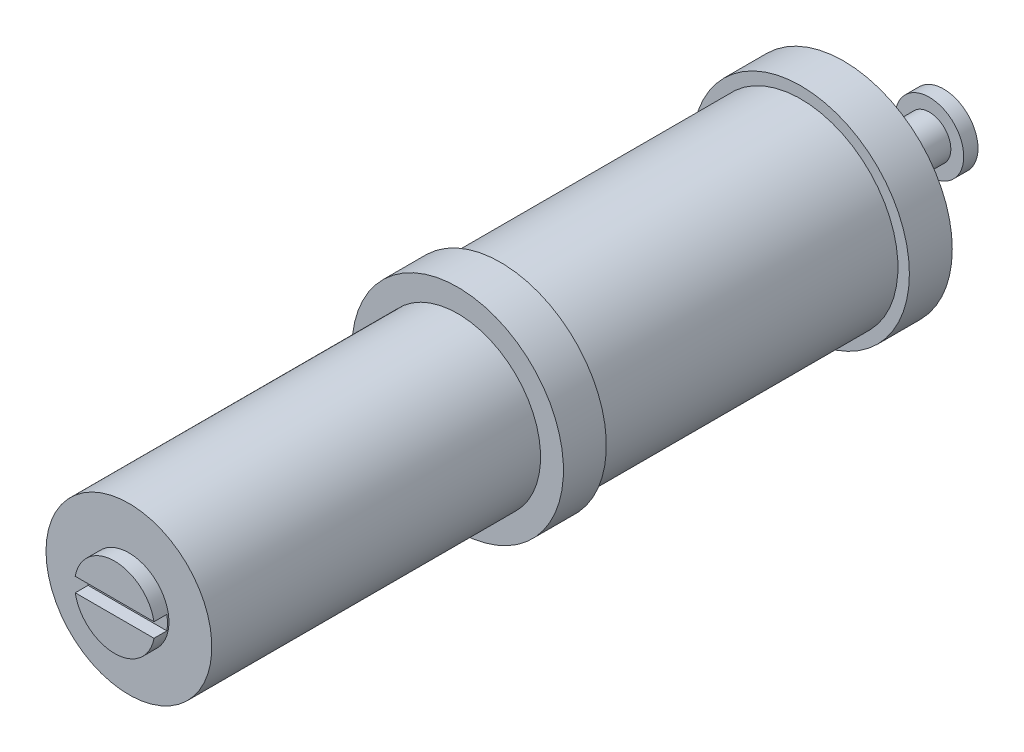
ISO-10303-21;
HEADER;
FILE_DESCRIPTION(('STEP AP214'),'2;1');
FILE_NAME('part.step','',(''),(''),'','','');
FILE_SCHEMA(('AUTOMOTIVE_DESIGN { 1 0 10303 214 1 1 1 1 }'));
ENDSEC;
DATA;
#1=APPLICATION_CONTEXT('core data for automotive mechanical design processes');
#2=APPLICATION_PROTOCOL_DEFINITION('international standard','automotive_design',2000,#1);
#3=PRODUCT_CONTEXT('',#1,'mechanical');
#4=PRODUCT('Part','Part','',(#3));
#5=PRODUCT_RELATED_PRODUCT_CATEGORY('part','',(#4));
#6=PRODUCT_DEFINITION_FORMATION('','',#4);
#7=PRODUCT_DEFINITION_CONTEXT('part definition',#1,'design');
#8=PRODUCT_DEFINITION('design','',#6,#7);
#9=PRODUCT_DEFINITION_SHAPE('','',#8);
#10=(LENGTH_UNIT() NAMED_UNIT(*) SI_UNIT(.MILLI.,.METRE.));
#11=(NAMED_UNIT(*) PLANE_ANGLE_UNIT() SI_UNIT($,.RADIAN.));
#12=(NAMED_UNIT(*) SI_UNIT($,.STERADIAN.) SOLID_ANGLE_UNIT());
#13=UNCERTAINTY_MEASURE_WITH_UNIT(LENGTH_MEASURE(1.E-05),#10,'distance_accuracy_value','');
#14=(GEOMETRIC_REPRESENTATION_CONTEXT(3) GLOBAL_UNCERTAINTY_ASSIGNED_CONTEXT((#13)) GLOBAL_UNIT_ASSIGNED_CONTEXT((#10,
#11,#12)) REPRESENTATION_CONTEXT('',''));
#15=CARTESIAN_POINT('',(0.,0.,0.));
#16=DIRECTION('',(0.,0.,1.));
#17=DIRECTION('',(1.,0.,0.));
#18=AXIS2_PLACEMENT_3D('',#15,#16,#17);
#19=CARTESIAN_POINT('',(0.,0.,0.));
#20=DIRECTION('',(0.,0.,1.));
#21=DIRECTION('',(1.,0.,0.));
#22=AXIS2_PLACEMENT_3D('',#19,#20,#21);
#23=CYLINDRICAL_SURFACE('',#22,3.8);
#24=CARTESIAN_POINT('',(0.,0.,1.5));
#25=DIRECTION('',(0.,0.,-1.));
#26=DIRECTION('',(1.,0.,0.));
#27=AXIS2_PLACEMENT_3D('',#24,#25,#26);
#28=CIRCLE('',#27,3.8);
#29=CARTESIAN_POINT('',(3.8,0.,1.5));
#30=VERTEX_POINT('',#29);
#31=EDGE_CURVE('E10',#30,#30,#28,.T.);
#32=ORIENTED_EDGE('',*,*,#31,.T.);
#33=EDGE_LOOP('',(#32));
#34=FACE_BOUND('',#33,.T.);
#35=CARTESIAN_POINT('',(0.,0.,0.));
#36=DIRECTION('',(0.,0.,1.));
#37=DIRECTION('',(1.,0.,0.));
#38=AXIS2_PLACEMENT_3D('',#35,#36,#37);
#39=CIRCLE('',#38,3.8);
#40=CARTESIAN_POINT('',(3.8,0.,0.));
#41=VERTEX_POINT('',#40);
#42=EDGE_CURVE('E26',#41,#41,#39,.T.);
#43=ORIENTED_EDGE('',*,*,#42,.T.);
#44=EDGE_LOOP('',(#43));
#45=FACE_BOUND('',#44,.T.);
#46=ADVANCED_FACE('F16',(#34,#45),#23,.T.);
#47=CARTESIAN_POINT('',(0.,0.,1.5));
#48=DIRECTION('',(0.,0.,1.));
#49=DIRECTION('',(1.,0.,0.));
#50=AXIS2_PLACEMENT_3D('',#47,#48,#49);
#51=PLANE('',#50);
#52=ORIENTED_EDGE('',*,*,#31,.F.);
#53=EDGE_LOOP('',(#52));
#54=FACE_BOUND('',#53,.T.);
#55=CARTESIAN_POINT('',(0.,0.,1.5));
#56=DIRECTION('',(0.,0.,1.));
#57=DIRECTION('',(-1.,0.,0.));
#58=AXIS2_PLACEMENT_3D('',#55,#56,#57);
#59=CIRCLE('',#58,3.4);
#60=CARTESIAN_POINT('',(-3.4,0.,1.5));
#61=VERTEX_POINT('',#60);
#62=EDGE_CURVE('E97',#61,#61,#59,.T.);
#63=ORIENTED_EDGE('',*,*,#62,.F.);
#64=EDGE_LOOP('',(#63));
#65=FACE_BOUND('',#64,.T.);
#66=ADVANCED_FACE('F150',(#54,#65),#51,.T.);
#67=CARTESIAN_POINT('',(0.,0.,13.5));
#68=DIRECTION('',(0.,0.,-1.));
#69=DIRECTION('',(-1.,0.,0.));
#70=AXIS2_PLACEMENT_3D('',#67,#68,#69);
#71=CYLINDRICAL_SURFACE('',#70,3.7);
#72=CARTESIAN_POINT('',(0.,0.,12.));
#73=DIRECTION('',(0.,0.,1.));
#74=DIRECTION('',(-1.,0.,0.));
#75=AXIS2_PLACEMENT_3D('',#72,#73,#74);
#76=CIRCLE('',#75,3.7);
#77=CARTESIAN_POINT('',(-3.7,0.,12.));
#78=VERTEX_POINT('',#77);
#79=EDGE_CURVE('E121',#78,#78,#76,.T.);
#80=ORIENTED_EDGE('',*,*,#79,.T.);
#81=EDGE_LOOP('',(#80));
#82=FACE_BOUND('',#81,.T.);
#83=CARTESIAN_POINT('',(0.,0.,13.5));
#84=DIRECTION('',(0.,0.,-1.));
#85=DIRECTION('',(-1.,0.,0.));
#86=AXIS2_PLACEMENT_3D('',#83,#84,#85);
#87=CIRCLE('',#86,3.7);
#88=CARTESIAN_POINT('',(-3.7,0.,13.5));
#89=VERTEX_POINT('',#88);
#90=EDGE_CURVE('E115',#89,#89,#87,.T.);
#91=ORIENTED_EDGE('',*,*,#90,.T.);
#92=EDGE_LOOP('',(#91));
#93=FACE_BOUND('',#92,.T.);
#94=ADVANCED_FACE('F156',(#82,#93),#71,.T.);
#95=CARTESIAN_POINT('',(0.,0.,12.));
#96=DIRECTION('',(0.,0.,-1.));
#97=DIRECTION('',(-1.,0.,0.));
#98=AXIS2_PLACEMENT_3D('',#95,#96,#97);
#99=PLANE('',#98);
#100=ORIENTED_EDGE('',*,*,#79,.F.);
#101=EDGE_LOOP('',(#100));
#102=FACE_BOUND('',#101,.T.);
#103=CARTESIAN_POINT('',(0.,0.,12.));
#104=DIRECTION('',(0.,0.,-1.));
#105=DIRECTION('',(-1.,0.,0.));
#106=AXIS2_PLACEMENT_3D('',#103,#104,#105);
#107=CIRCLE('',#106,3.4);
#108=CARTESIAN_POINT('',(-3.4,0.,12.));
#109=VERTEX_POINT('',#108);
#110=EDGE_CURVE('E101',#109,#109,#107,.T.);
#111=ORIENTED_EDGE('',*,*,#110,.F.);
#112=EDGE_LOOP('',(#111));
#113=FACE_BOUND('',#112,.T.);
#114=ADVANCED_FACE('F162',(#102,#113),#99,.T.);
#115=CARTESIAN_POINT('',(0.092174256621989,0.,25.05));
#116=DIRECTION('',(0.,0.,1.));
#117=DIRECTION('',(1.,0.,0.));
#118=AXIS2_PLACEMENT_3D('',#115,#116,#117);
#119=PLANE('',#118);
#120=CARTESIAN_POINT('',(0.,0.,25.05));
#121=DIRECTION('',(0.,0.,-1.));
#122=DIRECTION('',(-1.,0.,0.));
#123=AXIS2_PLACEMENT_3D('',#120,#121,#122);
#124=CIRCLE('',#123,1.4);
#125=CARTESIAN_POINT('',(1.37749773139559,0.25,25.05));
#126=VERTEX_POINT('',#125);
#127=CARTESIAN_POINT('',(1.37749773139559,-0.25,25.05));
#128=VERTEX_POINT('',#127);
#129=EDGE_CURVE('E35',#126,#128,#124,.T.);
#130=ORIENTED_EDGE('',*,*,#129,.F.);
#131=DIRECTION('',(-1.,0.,0.));
#132=VECTOR('',#131,1.);
#133=CARTESIAN_POINT('',(1.37749773139559,0.25,25.05));
#134=LINE('',#133,#132);
#135=CARTESIAN_POINT('',(-1.37749773139559,0.25,25.05));
#136=VERTEX_POINT('',#135);
#137=EDGE_CURVE('E112',#126,#136,#134,.T.);
#138=ORIENTED_EDGE('',*,*,#137,.T.);
#139=CARTESIAN_POINT('',(0.,0.,25.05));
#140=DIRECTION('',(0.,0.,-1.));
#141=DIRECTION('',(-1.,0.,0.));
#142=AXIS2_PLACEMENT_3D('',#139,#140,#141);
#143=CIRCLE('',#142,1.4);
#144=CARTESIAN_POINT('',(-1.37749773139559,-0.25,25.05));
#145=VERTEX_POINT('',#144);
#146=EDGE_CURVE('E72',#145,#136,#143,.T.);
#147=ORIENTED_EDGE('',*,*,#146,.F.);
#148=DIRECTION('',(1.,0.,0.));
#149=VECTOR('',#148,1.);
#150=CARTESIAN_POINT('',(-1.37749773139559,-0.25,25.05));
#151=LINE('',#150,#149);
#152=EDGE_CURVE('E104',#145,#128,#151,.T.);
#153=ORIENTED_EDGE('',*,*,#152,.T.);
#154=EDGE_LOOP('',(#130,#138,#147,#153));
#155=FACE_BOUND('',#154,.T.);
#156=ADVANCED_FACE('F166',(#155),#119,.T.);
#157=CARTESIAN_POINT('',(-1.78629968874138,-0.25,25.5));
#158=DIRECTION('',(0.,-1.,0.));
#159=DIRECTION('',(0.,0.,-1.));
#160=AXIS2_PLACEMENT_3D('',#157,#158,#159);
#161=PLANE('',#160);
#162=DIRECTION('',(0.,0.,1.));
#163=VECTOR('',#162,1.);
#164=CARTESIAN_POINT('',(1.37749773139559,-0.25,25.05));
#165=LINE('',#164,#163);
#166=CARTESIAN_POINT('',(1.37749773139559,-0.25,25.5));
#167=VERTEX_POINT('',#166);
#168=EDGE_CURVE('E108',#128,#167,#165,.T.);
#169=ORIENTED_EDGE('',*,*,#168,.F.);
#170=ORIENTED_EDGE('',*,*,#152,.F.);
#171=DIRECTION('',(0.,0.,-1.));
#172=VECTOR('',#171,1.);
#173=CARTESIAN_POINT('',(-1.37749773139559,-0.25,25.5));
#174=LINE('',#173,#172);
#175=CARTESIAN_POINT('',(-1.37749773139559,-0.25,25.5));
#176=VERTEX_POINT('',#175);
#177=EDGE_CURVE('E106',#176,#145,#174,.T.);
#178=ORIENTED_EDGE('',*,*,#177,.F.);
#179=DIRECTION('',(-1.,0.,0.));
#180=VECTOR('',#179,1.);
#181=CARTESIAN_POINT('',(1.37749773139559,-0.25,25.5));
#182=LINE('',#181,#180);
#183=EDGE_CURVE('E65',#167,#176,#182,.T.);
#184=ORIENTED_EDGE('',*,*,#183,.F.);
#185=EDGE_LOOP('',(#169,#170,#178,#184));
#186=FACE_BOUND('',#185,.T.);
#187=ADVANCED_FACE('F170',(#186),#161,.F.);
#188=CARTESIAN_POINT('',(1.97064820198536,0.25,25.5));
#189=DIRECTION('',(0.,1.,0.));
#190=DIRECTION('',(0.,0.,1.));
#191=AXIS2_PLACEMENT_3D('',#188,#189,#190);
#192=PLANE('',#191);
#193=DIRECTION('',(0.,0.,-1.));
#194=VECTOR('',#193,1.);
#195=CARTESIAN_POINT('',(1.37749773139559,0.25,25.5));
#196=LINE('',#195,#194);
#197=CARTESIAN_POINT('',(1.37749773139559,0.25,25.5));
#198=VERTEX_POINT('',#197);
#199=EDGE_CURVE('E63',#198,#126,#196,.T.);
#200=ORIENTED_EDGE('',*,*,#199,.F.);
#201=DIRECTION('',(1.,0.,0.));
#202=VECTOR('',#201,1.);
#203=CARTESIAN_POINT('',(-1.37749773139559,0.25,25.5));
#204=LINE('',#203,#202);
#205=CARTESIAN_POINT('',(-1.37749773139559,0.25,25.5));
#206=VERTEX_POINT('',#205);
#207=EDGE_CURVE('E55',#206,#198,#204,.T.);
#208=ORIENTED_EDGE('',*,*,#207,.F.);
#209=DIRECTION('',(0.,0.,1.));
#210=VECTOR('',#209,1.);
#211=CARTESIAN_POINT('',(-1.37749773139559,0.25,25.05));
#212=LINE('',#211,#210);
#213=EDGE_CURVE('E61',#136,#206,#212,.T.);
#214=ORIENTED_EDGE('',*,*,#213,.F.);
#215=ORIENTED_EDGE('',*,*,#137,.F.);
#216=EDGE_LOOP('',(#200,#208,#214,#215));
#217=FACE_BOUND('',#216,.T.);
#218=ADVANCED_FACE('F60',(#217),#192,.F.);
#219=CARTESIAN_POINT('',(0.,0.,25.));
#220=DIRECTION('',(0.,0.,1.));
#221=DIRECTION('',(-1.,0.,0.));
#222=AXIS2_PLACEMENT_3D('',#219,#220,#221);
#223=CYLINDRICAL_SURFACE('',#222,1.4);
#224=CARTESIAN_POINT('',(0.,0.,25.));
#225=DIRECTION('',(0.,0.,-1.));
#226=DIRECTION('',(-1.,0.,0.));
#227=AXIS2_PLACEMENT_3D('',#224,#225,#226);
#228=CIRCLE('',#227,1.4);
#229=CARTESIAN_POINT('',(-1.4,0.,25.));
#230=VERTEX_POINT('',#229);
#231=EDGE_CURVE('E93',#230,#230,#228,.T.);
#232=ORIENTED_EDGE('',*,*,#231,.F.);
#233=EDGE_LOOP('',(#232));
#234=FACE_BOUND('',#233,.T.);
#235=ORIENTED_EDGE('',*,*,#199,.T.);
#236=ORIENTED_EDGE('',*,*,#129,.T.);
#237=ORIENTED_EDGE('',*,*,#168,.T.);
#238=CARTESIAN_POINT('',(0.,0.,25.5));
#239=DIRECTION('',(0.,0.,-1.));
#240=DIRECTION('',(-1.,0.,0.));
#241=AXIS2_PLACEMENT_3D('',#238,#239,#240);
#242=CIRCLE('',#241,1.4);
#243=EDGE_CURVE('E79',#167,#176,#242,.T.);
#244=ORIENTED_EDGE('',*,*,#243,.T.);
#245=ORIENTED_EDGE('',*,*,#177,.T.);
#246=ORIENTED_EDGE('',*,*,#146,.T.);
#247=ORIENTED_EDGE('',*,*,#213,.T.);
#248=CARTESIAN_POINT('',(0.,0.,25.5));
#249=DIRECTION('',(0.,0.,-1.));
#250=DIRECTION('',(-1.,0.,0.));
#251=AXIS2_PLACEMENT_3D('',#248,#249,#250);
#252=CIRCLE('',#251,1.4);
#253=EDGE_CURVE('E70',#206,#198,#252,.T.);
#254=ORIENTED_EDGE('',*,*,#253,.T.);
#255=EDGE_LOOP('',(#235,#236,#237,#244,#245,#246,#247,#254));
#256=FACE_BOUND('',#255,.T.);
#257=ADVANCED_FACE('F69',(#234,#256),#223,.T.);
#258=CARTESIAN_POINT('',(0.,0.,25.5));
#259=DIRECTION('',(0.,0.,-1.));
#260=DIRECTION('',(-1.,0.,0.));
#261=AXIS2_PLACEMENT_3D('',#258,#259,#260);
#262=PLANE('',#261);
#263=ORIENTED_EDGE('',*,*,#183,.T.);
#264=ORIENTED_EDGE('',*,*,#243,.F.);
#265=EDGE_LOOP('',(#263,#264));
#266=FACE_BOUND('',#265,.T.);
#267=ADVANCED_FACE('F178',(#266),#262,.F.);
#268=CARTESIAN_POINT('',(0.,0.,25.5));
#269=DIRECTION('',(0.,0.,-1.));
#270=DIRECTION('',(-1.,0.,0.));
#271=AXIS2_PLACEMENT_3D('',#268,#269,#270);
#272=PLANE('',#271);
#273=ORIENTED_EDGE('',*,*,#207,.T.);
#274=ORIENTED_EDGE('',*,*,#253,.F.);
#275=EDGE_LOOP('',(#273,#274));
#276=FACE_BOUND('',#275,.T.);
#277=ADVANCED_FACE('F74',(#276),#272,.F.);
#278=CARTESIAN_POINT('',(0.,0.,-3.));
#279=DIRECTION('',(0.,0.,1.));
#280=DIRECTION('',(1.,0.,0.));
#281=AXIS2_PLACEMENT_3D('',#278,#279,#280);
#282=PLANE('',#281);
#283=CARTESIAN_POINT('',(0.,0.,-3.));
#284=DIRECTION('',(0.,0.,1.));
#285=DIRECTION('',(1.,0.,0.));
#286=AXIS2_PLACEMENT_3D('',#283,#284,#285);
#287=CIRCLE('',#286,1.2);
#288=CARTESIAN_POINT('',(1.2,0.,-3.));
#289=VERTEX_POINT('',#288);
#290=EDGE_CURVE('E66',#289,#289,#287,.T.);
#291=ORIENTED_EDGE('',*,*,#290,.T.);
#292=EDGE_LOOP('',(#291));
#293=FACE_BOUND('',#292,.T.);
#294=CARTESIAN_POINT('',(0.,0.,-3.));
#295=DIRECTION('',(0.,0.,1.));
#296=DIRECTION('',(1.,0.,0.));
#297=AXIS2_PLACEMENT_3D('',#294,#295,#296);
#298=CIRCLE('',#297,0.75);
#299=CARTESIAN_POINT('',(0.75,0.,-3.));
#300=VERTEX_POINT('',#299);
#301=EDGE_CURVE('E84',#300,#300,#298,.T.);
#302=ORIENTED_EDGE('',*,*,#301,.F.);
#303=EDGE_LOOP('',(#302));
#304=FACE_BOUND('',#303,.T.);
#305=ADVANCED_FACE('F185',(#293,#304),#282,.T.);
#306=CARTESIAN_POINT('',(0.,0.,-3.));
#307=DIRECTION('',(0.,0.,-1.));
#308=DIRECTION('',(1.,0.,0.));
#309=AXIS2_PLACEMENT_3D('',#306,#307,#308);
#310=CYLINDRICAL_SURFACE('',#309,1.2);
#311=CARTESIAN_POINT('',(0.,0.,-3.5));
#312=DIRECTION('',(0.,0.,1.));
#313=DIRECTION('',(1.,0.,0.));
#314=AXIS2_PLACEMENT_3D('',#311,#312,#313);
#315=CIRCLE('',#314,1.2);
#316=CARTESIAN_POINT('',(1.2,0.,-3.5));
#317=VERTEX_POINT('',#316);
#318=EDGE_CURVE('E83',#317,#317,#315,.T.);
#319=ORIENTED_EDGE('',*,*,#318,.T.);
#320=EDGE_LOOP('',(#319));
#321=FACE_BOUND('',#320,.T.);
#322=ORIENTED_EDGE('',*,*,#290,.F.);
#323=EDGE_LOOP('',(#322));
#324=FACE_BOUND('',#323,.T.);
#325=ADVANCED_FACE('F146',(#321,#324),#310,.T.);
#326=CARTESIAN_POINT('',(0.,0.,-3.5));
#327=DIRECTION('',(0.,0.,1.));
#328=DIRECTION('',(1.,0.,0.));
#329=AXIS2_PLACEMENT_3D('',#326,#327,#328);
#330=PLANE('',#329);
#331=ORIENTED_EDGE('',*,*,#318,.F.);
#332=EDGE_LOOP('',(#331));
#333=FACE_BOUND('',#332,.T.);
#334=ADVANCED_FACE('F136',(#333),#330,.F.);
#335=CARTESIAN_POINT('',(0.,0.,0.));
#336=DIRECTION('',(0.,0.,-1.));
#337=DIRECTION('',(1.,0.,0.));
#338=AXIS2_PLACEMENT_3D('',#335,#336,#337);
#339=CYLINDRICAL_SURFACE('',#338,0.75);
#340=ORIENTED_EDGE('',*,*,#301,.T.);
#341=EDGE_LOOP('',(#340));
#342=FACE_BOUND('',#341,.T.);
#343=CARTESIAN_POINT('',(0.,0.,0.));
#344=DIRECTION('',(0.,0.,1.));
#345=DIRECTION('',(1.,0.,0.));
#346=AXIS2_PLACEMENT_3D('',#343,#344,#345);
#347=CIRCLE('',#346,0.75);
#348=CARTESIAN_POINT('',(0.75,0.,0.));
#349=VERTEX_POINT('',#348);
#350=EDGE_CURVE('E90',#349,#349,#347,.T.);
#351=ORIENTED_EDGE('',*,*,#350,.F.);
#352=EDGE_LOOP('',(#351));
#353=FACE_BOUND('',#352,.T.);
#354=ADVANCED_FACE('F133',(#342,#353),#339,.T.);
#355=CARTESIAN_POINT('',(0.,0.,13.5));
#356=DIRECTION('',(0.,0.,1.));
#357=DIRECTION('',(-1.,0.,0.));
#358=AXIS2_PLACEMENT_3D('',#355,#356,#357);
#359=CYLINDRICAL_SURFACE('',#358,2.9);
#360=CARTESIAN_POINT('',(0.,0.,25.));
#361=DIRECTION('',(0.,0.,-1.));
#362=DIRECTION('',(-1.,0.,0.));
#363=AXIS2_PLACEMENT_3D('',#360,#361,#362);
#364=CIRCLE('',#363,2.9);
#365=CARTESIAN_POINT('',(-2.9,0.,25.));
#366=VERTEX_POINT('',#365);
#367=EDGE_CURVE('E87',#366,#366,#364,.T.);
#368=ORIENTED_EDGE('',*,*,#367,.T.);
#369=EDGE_LOOP('',(#368));
#370=FACE_BOUND('',#369,.T.);
#371=CARTESIAN_POINT('',(0.,0.,13.5));
#372=DIRECTION('',(0.,0.,-1.));
#373=DIRECTION('',(-1.,0.,0.));
#374=AXIS2_PLACEMENT_3D('',#371,#372,#373);
#375=CIRCLE('',#374,2.9);
#376=CARTESIAN_POINT('',(-2.9,0.,13.5));
#377=VERTEX_POINT('',#376);
#378=EDGE_CURVE('E20',#377,#377,#375,.T.);
#379=ORIENTED_EDGE('',*,*,#378,.F.);
#380=EDGE_LOOP('',(#379));
#381=FACE_BOUND('',#380,.T.);
#382=ADVANCED_FACE('F135',(#370,#381),#359,.T.);
#383=CARTESIAN_POINT('',(0.,0.,25.));
#384=DIRECTION('',(0.,0.,-1.));
#385=DIRECTION('',(-1.,0.,0.));
#386=AXIS2_PLACEMENT_3D('',#383,#384,#385);
#387=PLANE('',#386);
#388=ORIENTED_EDGE('',*,*,#367,.F.);
#389=EDGE_LOOP('',(#388));
#390=FACE_BOUND('',#389,.T.);
#391=ORIENTED_EDGE('',*,*,#231,.T.);
#392=EDGE_LOOP('',(#391));
#393=FACE_BOUND('',#392,.T.);
#394=ADVANCED_FACE('F144',(#390,#393),#387,.F.);
#395=CARTESIAN_POINT('',(0.,0.,0.));
#396=DIRECTION('',(0.,0.,1.));
#397=DIRECTION('',(-1.,0.,0.));
#398=AXIS2_PLACEMENT_3D('',#395,#396,#397);
#399=CYLINDRICAL_SURFACE('',#398,3.4);
#400=ORIENTED_EDGE('',*,*,#62,.T.);
#401=EDGE_LOOP('',(#400));
#402=FACE_BOUND('',#401,.T.);
#403=ORIENTED_EDGE('',*,*,#110,.T.);
#404=EDGE_LOOP('',(#403));
#405=FACE_BOUND('',#404,.T.);
#406=ADVANCED_FACE('F231',(#402,#405),#399,.T.);
#407=CARTESIAN_POINT('',(0.,0.,13.5));
#408=DIRECTION('',(0.,0.,-1.));
#409=DIRECTION('',(-1.,0.,0.));
#410=AXIS2_PLACEMENT_3D('',#407,#408,#409);
#411=PLANE('',#410);
#412=ORIENTED_EDGE('',*,*,#90,.F.);
#413=EDGE_LOOP('',(#412));
#414=FACE_BOUND('',#413,.T.);
#415=ORIENTED_EDGE('',*,*,#378,.T.);
#416=EDGE_LOOP('',(#415));
#417=FACE_BOUND('',#416,.T.);
#418=ADVANCED_FACE('F130',(#414,#417),#411,.F.);
#419=CARTESIAN_POINT('',(0.,0.,0.));
#420=DIRECTION('',(0.,0.,-1.));
#421=DIRECTION('',(-1.,0.,0.));
#422=AXIS2_PLACEMENT_3D('',#419,#420,#421);
#423=PLANE('',#422);
#424=ORIENTED_EDGE('',*,*,#42,.F.);
#425=EDGE_LOOP('',(#424));
#426=FACE_BOUND('',#425,.T.);
#427=ORIENTED_EDGE('',*,*,#350,.T.);
#428=EDGE_LOOP('',(#427));
#429=FACE_BOUND('',#428,.T.);
#430=ADVANCED_FACE('F18',(#426,#429),#423,.T.);
#431=CLOSED_SHELL('',(#46,#66,#94,#114,#156,#187,#218,#257,#267,#277,#305,#325,#334,#354,#382,
#394,#406,#418,#430));
#432=MANIFOLD_SOLID_BREP('B1',#431);
#433=ADVANCED_BREP_SHAPE_REPRESENTATION('',(#18,#432),#14);
#434=SHAPE_DEFINITION_REPRESENTATION(#9,#433);
ENDSEC;
END-ISO-10303-21;
